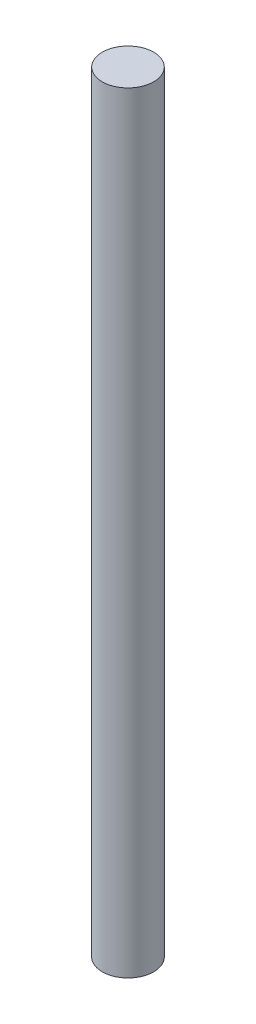
ISO-10303-21;
HEADER;
FILE_DESCRIPTION(('STEP AP214'),'2;1');
FILE_NAME('part.step','',(''),(''),'','','');
FILE_SCHEMA(('AUTOMOTIVE_DESIGN { 1 0 10303 214 1 1 1 1 }'));
ENDSEC;
DATA;
#1=APPLICATION_CONTEXT('core data for automotive mechanical design processes');
#2=APPLICATION_PROTOCOL_DEFINITION('international standard','automotive_design',2000,#1);
#3=PRODUCT_CONTEXT('',#1,'mechanical');
#4=PRODUCT('Part','Part','',(#3));
#5=PRODUCT_RELATED_PRODUCT_CATEGORY('part','',(#4));
#6=PRODUCT_DEFINITION_FORMATION('','',#4);
#7=PRODUCT_DEFINITION_CONTEXT('part definition',#1,'design');
#8=PRODUCT_DEFINITION('design','',#6,#7);
#9=PRODUCT_DEFINITION_SHAPE('','',#8);
#10=(LENGTH_UNIT() NAMED_UNIT(*) SI_UNIT(.MILLI.,.METRE.));
#11=(NAMED_UNIT(*) PLANE_ANGLE_UNIT() SI_UNIT($,.RADIAN.));
#12=(NAMED_UNIT(*) SI_UNIT($,.STERADIAN.) SOLID_ANGLE_UNIT());
#13=UNCERTAINTY_MEASURE_WITH_UNIT(LENGTH_MEASURE(1.E-05),#10,'distance_accuracy_value','');
#14=(GEOMETRIC_REPRESENTATION_CONTEXT(3) GLOBAL_UNCERTAINTY_ASSIGNED_CONTEXT((#13)) GLOBAL_UNIT_ASSIGNED_CONTEXT((#10,
#11,#12)) REPRESENTATION_CONTEXT('',''));
#15=CARTESIAN_POINT('',(0.,0.,0.));
#16=DIRECTION('',(0.,0.,1.));
#17=DIRECTION('',(1.,0.,0.));
#18=AXIS2_PLACEMENT_3D('',#15,#16,#17);
#19=CARTESIAN_POINT('',(0.,120.,0.));
#20=DIRECTION('',(0.,-1.,0.));
#21=DIRECTION('',(0.,0.,-1.));
#22=AXIS2_PLACEMENT_3D('',#19,#20,#21);
#23=CYLINDRICAL_SURFACE('',#22,4.);
#24=CARTESIAN_POINT('',(0.,120.,0.));
#25=DIRECTION('',(0.,1.,0.));
#26=DIRECTION('',(0.,0.,1.));
#27=AXIS2_PLACEMENT_3D('',#24,#25,#26);
#28=CIRCLE('',#27,4.);
#29=CARTESIAN_POINT('',(0.,120.,4.));
#30=VERTEX_POINT('',#29);
#31=EDGE_CURVE('E10',#30,#30,#28,.T.);
#32=ORIENTED_EDGE('',*,*,#31,.F.);
#33=EDGE_LOOP('',(#32));
#34=FACE_BOUND('',#33,.T.);
#35=CARTESIAN_POINT('',(0.,0.,0.));
#36=DIRECTION('',(0.,1.,0.));
#37=DIRECTION('',(0.,0.,1.));
#38=AXIS2_PLACEMENT_3D('',#35,#36,#37);
#39=CIRCLE('',#38,4.);
#40=CARTESIAN_POINT('',(0.,0.,4.));
#41=VERTEX_POINT('',#40);
#42=EDGE_CURVE('E44',#41,#41,#39,.T.);
#43=ORIENTED_EDGE('',*,*,#42,.T.);
#44=EDGE_LOOP('',(#43));
#45=FACE_BOUND('',#44,.T.);
#46=ADVANCED_FACE('F41',(#34,#45),#23,.T.);
#47=CARTESIAN_POINT('',(0.,120.,0.));
#48=DIRECTION('',(0.,1.,0.));
#49=DIRECTION('',(0.,0.,1.));
#50=AXIS2_PLACEMENT_3D('',#47,#48,#49);
#51=PLANE('',#50);
#52=ORIENTED_EDGE('',*,*,#31,.T.);
#53=EDGE_LOOP('',(#52));
#54=FACE_BOUND('',#53,.T.);
#55=ADVANCED_FACE('F58',(#54),#51,.T.);
#56=CARTESIAN_POINT('',(0.,0.,0.));
#57=DIRECTION('',(0.,1.,0.));
#58=DIRECTION('',(0.,0.,1.));
#59=AXIS2_PLACEMENT_3D('',#56,#57,#58);
#60=PLANE('',#59);
#61=ORIENTED_EDGE('',*,*,#42,.F.);
#62=EDGE_LOOP('',(#61));
#63=FACE_BOUND('',#62,.T.);
#64=ADVANCED_FACE('F56',(#63),#60,.F.);
#65=CLOSED_SHELL('',(#46,#55,#64));
#66=MANIFOLD_SOLID_BREP('B2',#65);
#67=ADVANCED_BREP_SHAPE_REPRESENTATION('',(#18,#66),#14);
#68=SHAPE_DEFINITION_REPRESENTATION(#9,#67);
ENDSEC;
END-ISO-10303-21;
